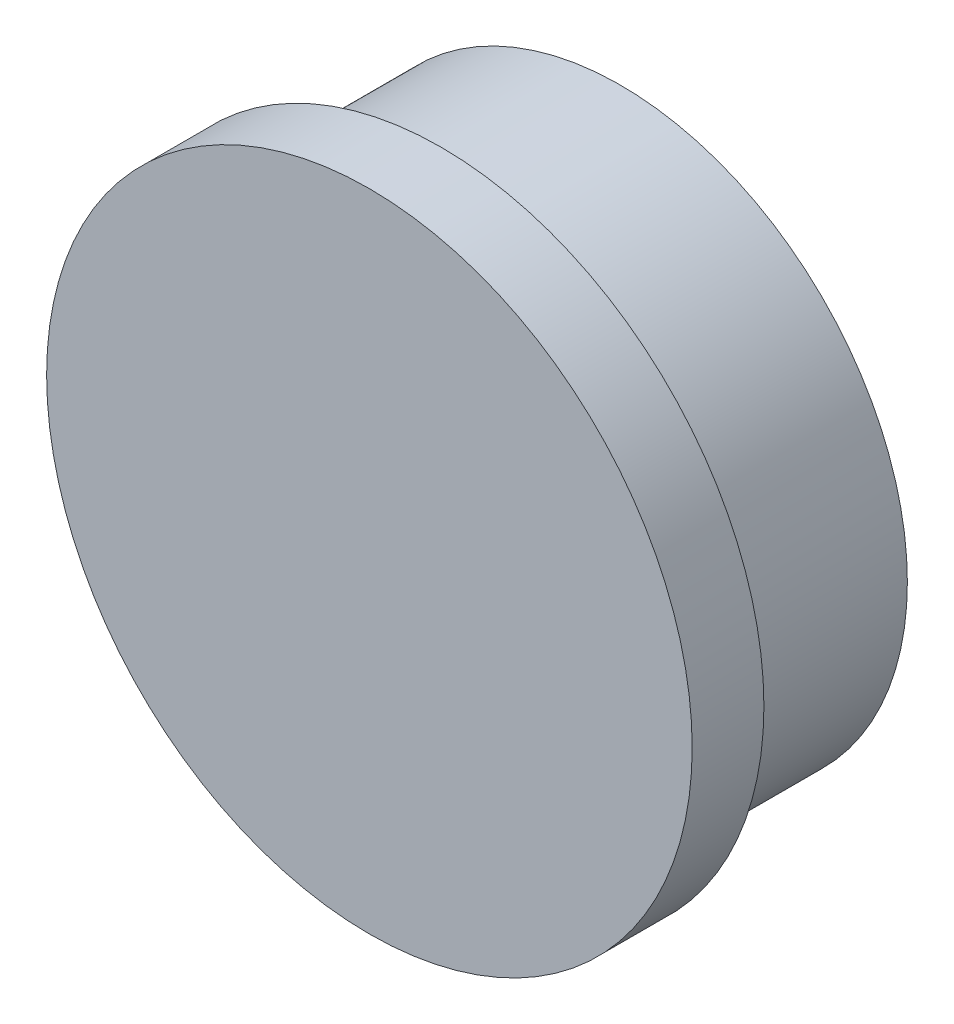
ISO-10303-21;
HEADER;
FILE_DESCRIPTION(('STEP AP214'),'2;1');
FILE_NAME('part.step','',(''),(''),'','','');
FILE_SCHEMA(('AUTOMOTIVE_DESIGN { 1 0 10303 214 1 1 1 1 }'));
ENDSEC;
DATA;
#1=APPLICATION_CONTEXT('core data for automotive mechanical design processes');
#2=APPLICATION_PROTOCOL_DEFINITION('international standard','automotive_design',2000,#1);
#3=PRODUCT_CONTEXT('',#1,'mechanical');
#4=PRODUCT('Part','Part','',(#3));
#5=PRODUCT_RELATED_PRODUCT_CATEGORY('part','',(#4));
#6=PRODUCT_DEFINITION_FORMATION('','',#4);
#7=PRODUCT_DEFINITION_CONTEXT('part definition',#1,'design');
#8=PRODUCT_DEFINITION('design','',#6,#7);
#9=PRODUCT_DEFINITION_SHAPE('','',#8);
#10=(LENGTH_UNIT() NAMED_UNIT(*) SI_UNIT(.MILLI.,.METRE.));
#11=(NAMED_UNIT(*) PLANE_ANGLE_UNIT() SI_UNIT($,.RADIAN.));
#12=(NAMED_UNIT(*) SI_UNIT($,.STERADIAN.) SOLID_ANGLE_UNIT());
#13=UNCERTAINTY_MEASURE_WITH_UNIT(LENGTH_MEASURE(1.E-05),#10,'distance_accuracy_value','');
#14=(GEOMETRIC_REPRESENTATION_CONTEXT(3) GLOBAL_UNCERTAINTY_ASSIGNED_CONTEXT((#13)) GLOBAL_UNIT_ASSIGNED_CONTEXT((#10,
#11,#12)) REPRESENTATION_CONTEXT('',''));
#15=CARTESIAN_POINT('',(0.,0.,0.));
#16=DIRECTION('',(0.,0.,1.));
#17=DIRECTION('',(1.,0.,0.));
#18=AXIS2_PLACEMENT_3D('',#15,#16,#17);
#19=CARTESIAN_POINT('',(0.,0.,2.));
#20=DIRECTION('',(0.,0.,-1.));
#21=DIRECTION('',(-1.,0.,0.));
#22=AXIS2_PLACEMENT_3D('',#19,#20,#21);
#23=CYLINDRICAL_SURFACE('',#22,9.);
#24=CARTESIAN_POINT('',(0.,0.,2.));
#25=DIRECTION('',(0.,0.,1.));
#26=DIRECTION('',(1.,0.,0.));
#27=AXIS2_PLACEMENT_3D('',#24,#25,#26);
#28=CIRCLE('',#27,9.);
#29=CARTESIAN_POINT('',(9.,0.,2.));
#30=VERTEX_POINT('',#29);
#31=EDGE_CURVE('E10',#30,#30,#28,.T.);
#32=ORIENTED_EDGE('',*,*,#31,.F.);
#33=EDGE_LOOP('',(#32));
#34=FACE_BOUND('',#33,.T.);
#35=CARTESIAN_POINT('',(0.,0.,0.));
#36=DIRECTION('',(0.,0.,1.));
#37=DIRECTION('',(1.,0.,0.));
#38=AXIS2_PLACEMENT_3D('',#35,#36,#37);
#39=CIRCLE('',#38,9.);
#40=CARTESIAN_POINT('',(9.,0.,0.));
#41=VERTEX_POINT('',#40);
#42=EDGE_CURVE('E34',#41,#41,#39,.T.);
#43=ORIENTED_EDGE('',*,*,#42,.T.);
#44=EDGE_LOOP('',(#43));
#45=FACE_BOUND('',#44,.T.);
#46=ADVANCED_FACE('F31',(#34,#45),#23,.T.);
#47=CARTESIAN_POINT('',(0.,0.,2.));
#48=DIRECTION('',(0.,0.,1.));
#49=DIRECTION('',(1.,0.,0.));
#50=AXIS2_PLACEMENT_3D('',#47,#48,#49);
#51=PLANE('',#50);
#52=ORIENTED_EDGE('',*,*,#31,.T.);
#53=EDGE_LOOP('',(#52));
#54=FACE_BOUND('',#53,.T.);
#55=ADVANCED_FACE('F61',(#54),#51,.T.);
#56=CARTESIAN_POINT('',(0.,0.,0.));
#57=DIRECTION('',(0.,0.,1.));
#58=DIRECTION('',(1.,0.,0.));
#59=AXIS2_PLACEMENT_3D('',#56,#57,#58);
#60=PLANE('',#59);
#61=CARTESIAN_POINT('',(0.,0.,0.));
#62=DIRECTION('',(0.,0.,1.));
#63=DIRECTION('',(1.,0.,0.));
#64=AXIS2_PLACEMENT_3D('',#61,#62,#63);
#65=CIRCLE('',#64,8.);
#66=CARTESIAN_POINT('',(8.,0.,0.));
#67=VERTEX_POINT('',#66);
#68=EDGE_CURVE('E43',#67,#67,#65,.T.);
#69=ORIENTED_EDGE('',*,*,#68,.T.);
#70=EDGE_LOOP('',(#69));
#71=FACE_BOUND('',#70,.T.);
#72=ORIENTED_EDGE('',*,*,#42,.F.);
#73=EDGE_LOOP('',(#72));
#74=FACE_BOUND('',#73,.T.);
#75=ADVANCED_FACE('F58',(#71,#74),#60,.F.);
#76=CARTESIAN_POINT('',(0.,0.,-5.));
#77=DIRECTION('',(0.,0.,1.));
#78=DIRECTION('',(1.,0.,0.));
#79=AXIS2_PLACEMENT_3D('',#76,#77,#78);
#80=CYLINDRICAL_SURFACE('',#79,8.);
#81=CARTESIAN_POINT('',(0.,0.,-5.));
#82=DIRECTION('',(0.,0.,1.));
#83=DIRECTION('',(1.,0.,0.));
#84=AXIS2_PLACEMENT_3D('',#81,#82,#83);
#85=CIRCLE('',#84,8.);
#86=CARTESIAN_POINT('',(8.,0.,-5.));
#87=VERTEX_POINT('',#86);
#88=EDGE_CURVE('E41',#87,#87,#85,.T.);
#89=ORIENTED_EDGE('',*,*,#88,.T.);
#90=EDGE_LOOP('',(#89));
#91=FACE_BOUND('',#90,.T.);
#92=ORIENTED_EDGE('',*,*,#68,.F.);
#93=EDGE_LOOP('',(#92));
#94=FACE_BOUND('',#93,.T.);
#95=ADVANCED_FACE('F49',(#91,#94),#80,.T.);
#96=CARTESIAN_POINT('',(0.,0.,-5.));
#97=DIRECTION('',(0.,0.,1.));
#98=DIRECTION('',(1.,0.,0.));
#99=AXIS2_PLACEMENT_3D('',#96,#97,#98);
#100=PLANE('',#99);
#101=ORIENTED_EDGE('',*,*,#88,.F.);
#102=EDGE_LOOP('',(#101));
#103=FACE_BOUND('',#102,.T.);
#104=ADVANCED_FACE('F52',(#103),#100,.F.);
#105=CLOSED_SHELL('',(#46,#55,#75,#95,#104));
#106=MANIFOLD_SOLID_BREP('B2',#105);
#107=ADVANCED_BREP_SHAPE_REPRESENTATION('',(#18,#106),#14);
#108=SHAPE_DEFINITION_REPRESENTATION(#9,#107);
ENDSEC;
END-ISO-10303-21;
